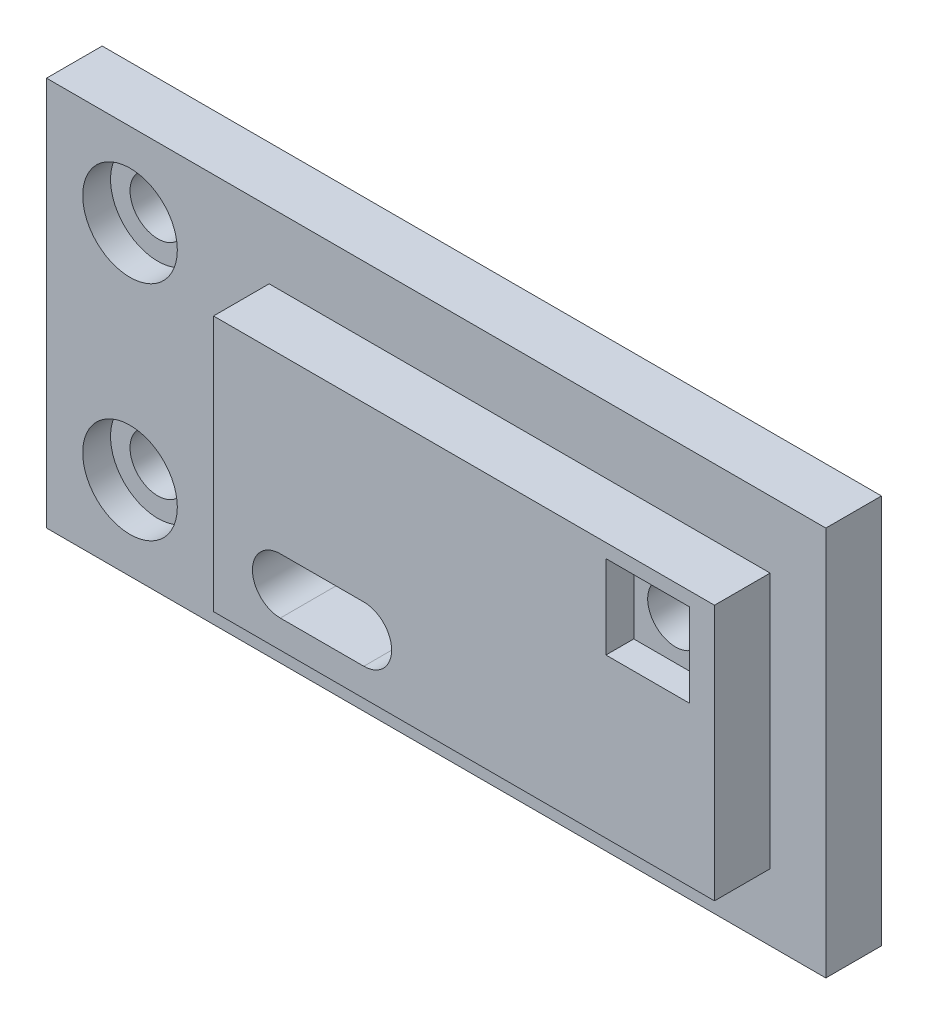
ISO-10303-21;
HEADER;
FILE_DESCRIPTION(('STEP AP214'),'2;1');
FILE_NAME('part.step','',(''),(''),'','','');
FILE_SCHEMA(('AUTOMOTIVE_DESIGN { 1 0 10303 214 1 1 1 1 }'));
ENDSEC;
DATA;
#1=APPLICATION_CONTEXT('core data for automotive mechanical design processes');
#2=APPLICATION_PROTOCOL_DEFINITION('international standard','automotive_design',2000,#1);
#3=PRODUCT_CONTEXT('',#1,'mechanical');
#4=PRODUCT('Part','Part','',(#3));
#5=PRODUCT_RELATED_PRODUCT_CATEGORY('part','',(#4));
#6=PRODUCT_DEFINITION_FORMATION('','',#4);
#7=PRODUCT_DEFINITION_CONTEXT('part definition',#1,'design');
#8=PRODUCT_DEFINITION('design','',#6,#7);
#9=PRODUCT_DEFINITION_SHAPE('','',#8);
#10=(LENGTH_UNIT() NAMED_UNIT(*) SI_UNIT(.MILLI.,.METRE.));
#11=(NAMED_UNIT(*) PLANE_ANGLE_UNIT() SI_UNIT($,.RADIAN.));
#12=(NAMED_UNIT(*) SI_UNIT($,.STERADIAN.) SOLID_ANGLE_UNIT());
#13=UNCERTAINTY_MEASURE_WITH_UNIT(LENGTH_MEASURE(1.E-05),#10,'distance_accuracy_value','');
#14=(GEOMETRIC_REPRESENTATION_CONTEXT(3) GLOBAL_UNCERTAINTY_ASSIGNED_CONTEXT((#13)) GLOBAL_UNIT_ASSIGNED_CONTEXT((#10,
#11,#12)) REPRESENTATION_CONTEXT('',''));
#15=CARTESIAN_POINT('',(0.,0.,0.));
#16=DIRECTION('',(0.,0.,1.));
#17=DIRECTION('',(1.,0.,0.));
#18=AXIS2_PLACEMENT_3D('',#15,#16,#17);
#19=CARTESIAN_POINT('',(-18.,-13.,0.));
#20=DIRECTION('',(0.,0.,1.));
#21=DIRECTION('',(1.,0.,0.));
#22=AXIS2_PLACEMENT_3D('',#19,#20,#21);
#23=CYLINDRICAL_SURFACE('',#22,5.);
#24=CARTESIAN_POINT('',(-18.,-13.,5.));
#25=DIRECTION('',(0.,0.,-1.));
#26=DIRECTION('',(-1.,0.,0.));
#27=AXIS2_PLACEMENT_3D('',#24,#25,#26);
#28=CIRCLE('',#27,5.);
#29=CARTESIAN_POINT('',(-18.,-7.99999999999999,5.));
#30=VERTEX_POINT('',#29);
#31=CARTESIAN_POINT('',(-18.,-18.,5.));
#32=VERTEX_POINT('',#31);
#33=EDGE_CURVE('E71',#30,#32,#28,.F.);
#34=ORIENTED_EDGE('',*,*,#33,.F.);
#35=DIRECTION('',(0.,0.,1.));
#36=VECTOR('',#35,1.);
#37=CARTESIAN_POINT('',(-18.,-7.99999999999999,0.));
#38=LINE('',#37,#36);
#39=CARTESIAN_POINT('',(-18.,-7.99999999999999,20.));
#40=VERTEX_POINT('',#39);
#41=EDGE_CURVE('E265',#30,#40,#38,.T.);
#42=ORIENTED_EDGE('',*,*,#41,.T.);
#43=CARTESIAN_POINT('',(-18.,-13.,20.));
#44=DIRECTION('',(0.,0.,1.));
#45=DIRECTION('',(-1.,0.,0.));
#46=AXIS2_PLACEMENT_3D('',#43,#44,#45);
#47=CIRCLE('',#46,5.);
#48=CARTESIAN_POINT('',(-18.,-18.,20.));
#49=VERTEX_POINT('',#48);
#50=EDGE_CURVE('E266',#40,#49,#47,.T.);
#51=ORIENTED_EDGE('',*,*,#50,.T.);
#52=DIRECTION('',(0.,0.,1.));
#53=VECTOR('',#52,1.);
#54=CARTESIAN_POINT('',(-18.,-18.,0.));
#55=LINE('',#54,#53);
#56=EDGE_CURVE('E278',#32,#49,#55,.T.);
#57=ORIENTED_EDGE('',*,*,#56,.F.);
#58=EDGE_LOOP('',(#34,#42,#51,#57));
#59=FACE_BOUND('',#58,.T.);
#60=ADVANCED_FACE('F49',(#59),#23,.F.);
#61=CARTESIAN_POINT('',(-18.,-7.99999999999999,0.));
#62=DIRECTION('',(0.,1.,0.));
#63=DIRECTION('',(0.,0.,1.));
#64=AXIS2_PLACEMENT_3D('',#61,#62,#63);
#65=PLANE('',#64);
#66=DIRECTION('',(-1.,0.,0.));
#67=VECTOR('',#66,1.);
#68=CARTESIAN_POINT('',(-18.,-7.99999999999999,5.));
#69=LINE('',#68,#67);
#70=CARTESIAN_POINT('',(-2.99999999999999,-7.99999999999999,5.));
#71=VERTEX_POINT('',#70);
#72=EDGE_CURVE('E225',#71,#30,#69,.T.);
#73=ORIENTED_EDGE('',*,*,#72,.F.);
#74=DIRECTION('',(0.,0.,1.));
#75=VECTOR('',#74,1.);
#76=CARTESIAN_POINT('',(-2.99999999999999,-7.99999999999999,0.));
#77=LINE('',#76,#75);
#78=CARTESIAN_POINT('',(-2.99999999999999,-7.99999999999999,20.));
#79=VERTEX_POINT('',#78);
#80=EDGE_CURVE('E280',#71,#79,#77,.T.);
#81=ORIENTED_EDGE('',*,*,#80,.T.);
#82=DIRECTION('',(-1.,0.,0.));
#83=VECTOR('',#82,1.);
#84=CARTESIAN_POINT('',(-18.,-7.99999999999999,20.));
#85=LINE('',#84,#83);
#86=EDGE_CURVE('E275',#79,#40,#85,.T.);
#87=ORIENTED_EDGE('',*,*,#86,.T.);
#88=ORIENTED_EDGE('',*,*,#41,.F.);
#89=EDGE_LOOP('',(#73,#81,#87,#88));
#90=FACE_BOUND('',#89,.T.);
#91=ADVANCED_FACE('F390',(#90),#65,.F.);
#92=CARTESIAN_POINT('',(-2.99999999999999,-13.,0.));
#93=DIRECTION('',(0.,0.,1.));
#94=DIRECTION('',(1.,0.,0.));
#95=AXIS2_PLACEMENT_3D('',#92,#93,#94);
#96=CYLINDRICAL_SURFACE('',#95,5.);
#97=CARTESIAN_POINT('',(-2.99999999999999,-13.,5.));
#98=DIRECTION('',(0.,0.,-1.));
#99=DIRECTION('',(-1.,0.,0.));
#100=AXIS2_PLACEMENT_3D('',#97,#98,#99);
#101=CIRCLE('',#100,5.);
#102=CARTESIAN_POINT('',(-2.99999999999999,-18.,5.));
#103=VERTEX_POINT('',#102);
#104=EDGE_CURVE('E220',#103,#71,#101,.F.);
#105=ORIENTED_EDGE('',*,*,#104,.F.);
#106=DIRECTION('',(0.,0.,1.));
#107=VECTOR('',#106,1.);
#108=CARTESIAN_POINT('',(-2.99999999999999,-18.,0.));
#109=LINE('',#108,#107);
#110=CARTESIAN_POINT('',(-2.99999999999999,-18.,20.));
#111=VERTEX_POINT('',#110);
#112=EDGE_CURVE('E282',#103,#111,#109,.T.);
#113=ORIENTED_EDGE('',*,*,#112,.T.);
#114=CARTESIAN_POINT('',(-2.99999999999999,-13.,20.));
#115=DIRECTION('',(0.,0.,1.));
#116=DIRECTION('',(1.,0.,0.));
#117=AXIS2_PLACEMENT_3D('',#114,#115,#116);
#118=CIRCLE('',#117,5.);
#119=EDGE_CURVE('E272',#111,#79,#118,.T.);
#120=ORIENTED_EDGE('',*,*,#119,.T.);
#121=ORIENTED_EDGE('',*,*,#80,.F.);
#122=EDGE_LOOP('',(#105,#113,#120,#121));
#123=FACE_BOUND('',#122,.T.);
#124=ADVANCED_FACE('F383',(#123),#96,.F.);
#125=CARTESIAN_POINT('',(-2.99999999999999,-18.,0.));
#126=DIRECTION('',(0.,-1.,0.));
#127=DIRECTION('',(0.,0.,-1.));
#128=AXIS2_PLACEMENT_3D('',#125,#126,#127);
#129=PLANE('',#128);
#130=DIRECTION('',(1.,0.,0.));
#131=VECTOR('',#130,1.);
#132=CARTESIAN_POINT('',(-2.99999999999999,-18.,5.));
#133=LINE('',#132,#131);
#134=EDGE_CURVE('E13',#32,#103,#133,.T.);
#135=ORIENTED_EDGE('',*,*,#134,.F.);
#136=ORIENTED_EDGE('',*,*,#56,.T.);
#137=DIRECTION('',(1.,0.,0.));
#138=VECTOR('',#137,1.);
#139=CARTESIAN_POINT('',(-2.99999999999999,-18.,20.));
#140=LINE('',#139,#138);
#141=EDGE_CURVE('E269',#49,#111,#140,.T.);
#142=ORIENTED_EDGE('',*,*,#141,.T.);
#143=ORIENTED_EDGE('',*,*,#112,.F.);
#144=EDGE_LOOP('',(#135,#136,#142,#143));
#145=FACE_BOUND('',#144,.T.);
#146=ADVANCED_FACE('F373',(#145),#129,.F.);
#147=CARTESIAN_POINT('',(48.,13.,0.));
#148=DIRECTION('',(0.,0.,1.));
#149=DIRECTION('',(1.,0.,0.));
#150=AXIS2_PLACEMENT_3D('',#147,#148,#149);
#151=CYLINDRICAL_SURFACE('',#150,5.);
#152=CARTESIAN_POINT('',(48.,13.,0.));
#153=DIRECTION('',(0.,0.,1.));
#154=DIRECTION('',(1.,0.,0.));
#155=AXIS2_PLACEMENT_3D('',#152,#153,#154);
#156=CIRCLE('',#155,5.);
#157=CARTESIAN_POINT('',(53.,13.,0.));
#158=VERTEX_POINT('',#157);
#159=EDGE_CURVE('E261',#158,#158,#156,.T.);
#160=ORIENTED_EDGE('',*,*,#159,.F.);
#161=EDGE_LOOP('',(#160));
#162=FACE_BOUND('',#161,.T.);
#163=CARTESIAN_POINT('',(48.,13.,15.));
#164=DIRECTION('',(0.,0.,1.));
#165=DIRECTION('',(1.,0.,0.));
#166=AXIS2_PLACEMENT_3D('',#163,#164,#165);
#167=CIRCLE('',#166,5.);
#168=CARTESIAN_POINT('',(53.,13.,15.));
#169=VERTEX_POINT('',#168);
#170=EDGE_CURVE('E254',#169,#169,#167,.F.);
#171=ORIENTED_EDGE('',*,*,#170,.F.);
#172=EDGE_LOOP('',(#171));
#173=FACE_BOUND('',#172,.T.);
#174=ADVANCED_FACE('F370',(#162,#173),#151,.F.);
#175=CARTESIAN_POINT('',(0.,0.,10.));
#176=DIRECTION('',(0.,0.,1.));
#177=DIRECTION('',(1.,0.,0.));
#178=AXIS2_PLACEMENT_3D('',#175,#176,#177);
#179=PLANE('',#178);
#180=CARTESIAN_POINT('',(-55.,20.,10.));
#181=DIRECTION('',(0.,0.,1.));
#182=DIRECTION('',(1.,0.,0.));
#183=AXIS2_PLACEMENT_3D('',#180,#181,#182);
#184=CIRCLE('',#183,8.5);
#185=CARTESIAN_POINT('',(-46.5,20.,10.));
#186=VERTEX_POINT('',#185);
#187=EDGE_CURVE('E318',#186,#186,#184,.T.);
#188=ORIENTED_EDGE('',*,*,#187,.F.);
#189=EDGE_LOOP('',(#188));
#190=FACE_BOUND('',#189,.T.);
#191=CARTESIAN_POINT('',(-55.,-20.,10.));
#192=DIRECTION('',(0.,0.,1.));
#193=DIRECTION('',(1.,0.,0.));
#194=AXIS2_PLACEMENT_3D('',#191,#192,#193);
#195=CIRCLE('',#194,8.5);
#196=CARTESIAN_POINT('',(-46.5,-20.,10.));
#197=VERTEX_POINT('',#196);
#198=EDGE_CURVE('E313',#197,#197,#195,.T.);
#199=ORIENTED_EDGE('',*,*,#198,.F.);
#200=EDGE_LOOP('',(#199));
#201=FACE_BOUND('',#200,.T.);
#202=DIRECTION('',(0.,-1.,0.));
#203=VECTOR('',#202,1.);
#204=CARTESIAN_POINT('',(-70.,35.,10.));
#205=LINE('',#204,#203);
#206=CARTESIAN_POINT('',(-70.,35.,10.));
#207=VERTEX_POINT('',#206);
#208=CARTESIAN_POINT('',(-70.,-35.,10.));
#209=VERTEX_POINT('',#208);
#210=EDGE_CURVE('E334',#207,#209,#205,.T.);
#211=ORIENTED_EDGE('',*,*,#210,.T.);
#212=DIRECTION('',(1.,0.,0.));
#213=VECTOR('',#212,1.);
#214=CARTESIAN_POINT('',(-70.,-35.,10.));
#215=LINE('',#214,#213);
#216=CARTESIAN_POINT('',(70.,-35.,10.));
#217=VERTEX_POINT('',#216);
#218=EDGE_CURVE('E337',#209,#217,#215,.T.);
#219=ORIENTED_EDGE('',*,*,#218,.T.);
#220=DIRECTION('',(0.,1.,0.));
#221=VECTOR('',#220,1.);
#222=CARTESIAN_POINT('',(70.,35.,10.));
#223=LINE('',#222,#221);
#224=CARTESIAN_POINT('',(70.,35.,10.));
#225=VERTEX_POINT('',#224);
#226=EDGE_CURVE('E340',#217,#225,#223,.T.);
#227=ORIENTED_EDGE('',*,*,#226,.T.);
#228=DIRECTION('',(-1.,0.,0.));
#229=VECTOR('',#228,1.);
#230=CARTESIAN_POINT('',(-70.,35.,10.));
#231=LINE('',#230,#229);
#232=EDGE_CURVE('E342',#225,#207,#231,.T.);
#233=ORIENTED_EDGE('',*,*,#232,.T.);
#234=EDGE_LOOP('',(#211,#219,#227,#233));
#235=FACE_BOUND('',#234,.T.);
#236=DIRECTION('',(1.,0.,0.));
#237=VECTOR('',#236,1.);
#238=CARTESIAN_POINT('',(-30.,-23.,10.));
#239=LINE('',#238,#237);
#240=CARTESIAN_POINT('',(-30.,-23.,10.));
#241=VERTEX_POINT('',#240);
#242=CARTESIAN_POINT('',(60.,-23.,10.));
#243=VERTEX_POINT('',#242);
#244=EDGE_CURVE('E298',#241,#243,#239,.T.);
#245=ORIENTED_EDGE('',*,*,#244,.F.);
#246=DIRECTION('',(0.,-1.,0.));
#247=VECTOR('',#246,1.);
#248=CARTESIAN_POINT('',(-30.,23.,10.));
#249=LINE('',#248,#247);
#250=CARTESIAN_POINT('',(-30.,23.,10.));
#251=VERTEX_POINT('',#250);
#252=EDGE_CURVE('E264',#251,#241,#249,.T.);
#253=ORIENTED_EDGE('',*,*,#252,.F.);
#254=DIRECTION('',(-1.,0.,0.));
#255=VECTOR('',#254,1.);
#256=CARTESIAN_POINT('',(-30.,23.,10.));
#257=LINE('',#256,#255);
#258=CARTESIAN_POINT('',(60.,23.,10.));
#259=VERTEX_POINT('',#258);
#260=EDGE_CURVE('E289',#259,#251,#257,.T.);
#261=ORIENTED_EDGE('',*,*,#260,.F.);
#262=DIRECTION('',(0.,1.,0.));
#263=VECTOR('',#262,1.);
#264=CARTESIAN_POINT('',(60.,23.,10.));
#265=LINE('',#264,#263);
#266=EDGE_CURVE('E300',#243,#259,#265,.T.);
#267=ORIENTED_EDGE('',*,*,#266,.F.);
#268=EDGE_LOOP('',(#245,#253,#261,#267));
#269=FACE_BOUND('',#268,.T.);
#270=ADVANCED_FACE('F372',(#190,#201,#235,#269),#179,.T.);
#271=CARTESIAN_POINT('',(-55.,20.,10.));
#272=DIRECTION('',(0.,0.,-1.));
#273=DIRECTION('',(-1.,0.,0.));
#274=AXIS2_PLACEMENT_3D('',#271,#272,#273);
#275=CYLINDRICAL_SURFACE('',#274,5.);
#276=CARTESIAN_POINT('',(-55.,20.,0.));
#277=DIRECTION('',(0.,0.,1.));
#278=DIRECTION('',(1.,0.,0.));
#279=AXIS2_PLACEMENT_3D('',#276,#277,#278);
#280=CIRCLE('',#279,5.);
#281=CARTESIAN_POINT('',(-50.,20.,0.));
#282=VERTEX_POINT('',#281);
#283=EDGE_CURVE('E329',#282,#282,#280,.T.);
#284=ORIENTED_EDGE('',*,*,#283,.F.);
#285=EDGE_LOOP('',(#284));
#286=FACE_BOUND('',#285,.T.);
#287=CARTESIAN_POINT('',(-55.,20.,5.));
#288=DIRECTION('',(0.,0.,1.));
#289=DIRECTION('',(1.,0.,0.));
#290=AXIS2_PLACEMENT_3D('',#287,#288,#289);
#291=CIRCLE('',#290,5.);
#292=CARTESIAN_POINT('',(-50.,20.,5.));
#293=VERTEX_POINT('',#292);
#294=EDGE_CURVE('E330',#293,#293,#291,.T.);
#295=ORIENTED_EDGE('',*,*,#294,.T.);
#296=EDGE_LOOP('',(#295));
#297=FACE_BOUND('',#296,.T.);
#298=ADVANCED_FACE('F380',(#286,#297),#275,.F.);
#299=CARTESIAN_POINT('',(-55.,-20.,10.));
#300=DIRECTION('',(0.,0.,-1.));
#301=DIRECTION('',(-1.,0.,0.));
#302=AXIS2_PLACEMENT_3D('',#299,#300,#301);
#303=CYLINDRICAL_SURFACE('',#302,5.);
#304=CARTESIAN_POINT('',(-55.,-20.,0.));
#305=DIRECTION('',(0.,0.,1.));
#306=DIRECTION('',(1.,0.,0.));
#307=AXIS2_PLACEMENT_3D('',#304,#305,#306);
#308=CIRCLE('',#307,5.);
#309=CARTESIAN_POINT('',(-50.,-20.,0.));
#310=VERTEX_POINT('',#309);
#311=EDGE_CURVE('E326',#310,#310,#308,.T.);
#312=ORIENTED_EDGE('',*,*,#311,.F.);
#313=EDGE_LOOP('',(#312));
#314=FACE_BOUND('',#313,.T.);
#315=CARTESIAN_POINT('',(-55.,-20.,5.));
#316=DIRECTION('',(0.,0.,1.));
#317=DIRECTION('',(1.,0.,0.));
#318=AXIS2_PLACEMENT_3D('',#315,#316,#317);
#319=CIRCLE('',#318,5.);
#320=CARTESIAN_POINT('',(-50.,-20.,5.));
#321=VERTEX_POINT('',#320);
#322=EDGE_CURVE('E317',#321,#321,#319,.T.);
#323=ORIENTED_EDGE('',*,*,#322,.T.);
#324=EDGE_LOOP('',(#323));
#325=FACE_BOUND('',#324,.T.);
#326=ADVANCED_FACE('F436',(#314,#325),#303,.F.);
#327=CARTESIAN_POINT('',(0.,0.,0.));
#328=DIRECTION('',(0.,0.,1.));
#329=DIRECTION('',(1.,0.,0.));
#330=AXIS2_PLACEMENT_3D('',#327,#328,#329);
#331=PLANE('',#330);
#332=DIRECTION('',(1.,0.,0.));
#333=VECTOR('',#332,1.);
#334=CARTESIAN_POINT('',(-18.,-5.99999999999999,0.));
#335=LINE('',#334,#333);
#336=CARTESIAN_POINT('',(-18.,-5.99999999999999,0.));
#337=VERTEX_POINT('',#336);
#338=CARTESIAN_POINT('',(-2.99999999999999,-5.99999999999999,0.));
#339=VERTEX_POINT('',#338);
#340=EDGE_CURVE('E214',#337,#339,#335,.T.);
#341=ORIENTED_EDGE('',*,*,#340,.F.);
#342=CARTESIAN_POINT('',(-18.,-13.,0.));
#343=DIRECTION('',(0.,0.,-1.));
#344=DIRECTION('',(-1.,0.,0.));
#345=AXIS2_PLACEMENT_3D('',#342,#343,#344);
#346=CIRCLE('',#345,7.);
#347=CARTESIAN_POINT('',(-18.,-20.,0.));
#348=VERTEX_POINT('',#347);
#349=EDGE_CURVE('E64',#348,#337,#346,.T.);
#350=ORIENTED_EDGE('',*,*,#349,.F.);
#351=DIRECTION('',(-1.,0.,0.));
#352=VECTOR('',#351,1.);
#353=CARTESIAN_POINT('',(-18.,-20.,0.));
#354=LINE('',#353,#352);
#355=CARTESIAN_POINT('',(-2.99999999999999,-20.,0.));
#356=VERTEX_POINT('',#355);
#357=EDGE_CURVE('E205',#356,#348,#354,.T.);
#358=ORIENTED_EDGE('',*,*,#357,.F.);
#359=CARTESIAN_POINT('',(-2.99999999999999,-13.,0.));
#360=DIRECTION('',(0.,0.,-1.));
#361=DIRECTION('',(1.,0.,0.));
#362=AXIS2_PLACEMENT_3D('',#359,#360,#361);
#363=CIRCLE('',#362,7.);
#364=EDGE_CURVE('E208',#339,#356,#363,.T.);
#365=ORIENTED_EDGE('',*,*,#364,.F.);
#366=EDGE_LOOP('',(#341,#350,#358,#365));
#367=FACE_BOUND('',#366,.T.);
#368=ORIENTED_EDGE('',*,*,#159,.T.);
#369=EDGE_LOOP('',(#368));
#370=FACE_BOUND('',#369,.T.);
#371=DIRECTION('',(0.,-1.,0.));
#372=VECTOR('',#371,1.);
#373=CARTESIAN_POINT('',(-70.,35.,0.));
#374=LINE('',#373,#372);
#375=CARTESIAN_POINT('',(-70.,35.,0.));
#376=VERTEX_POINT('',#375);
#377=CARTESIAN_POINT('',(-70.,-35.,0.));
#378=VERTEX_POINT('',#377);
#379=EDGE_CURVE('E333',#376,#378,#374,.T.);
#380=ORIENTED_EDGE('',*,*,#379,.F.);
#381=DIRECTION('',(-1.,0.,0.));
#382=VECTOR('',#381,1.);
#383=CARTESIAN_POINT('',(-70.,35.,0.));
#384=LINE('',#383,#382);
#385=CARTESIAN_POINT('',(70.,35.,0.));
#386=VERTEX_POINT('',#385);
#387=EDGE_CURVE('E338',#386,#376,#384,.T.);
#388=ORIENTED_EDGE('',*,*,#387,.F.);
#389=DIRECTION('',(0.,1.,0.));
#390=VECTOR('',#389,1.);
#391=CARTESIAN_POINT('',(70.,35.,0.));
#392=LINE('',#391,#390);
#393=CARTESIAN_POINT('',(70.,-35.,0.));
#394=VERTEX_POINT('',#393);
#395=EDGE_CURVE('E349',#394,#386,#392,.T.);
#396=ORIENTED_EDGE('',*,*,#395,.F.);
#397=DIRECTION('',(1.,0.,0.));
#398=VECTOR('',#397,1.);
#399=CARTESIAN_POINT('',(-70.,-35.,0.));
#400=LINE('',#399,#398);
#401=EDGE_CURVE('E347',#378,#394,#400,.T.);
#402=ORIENTED_EDGE('',*,*,#401,.F.);
#403=EDGE_LOOP('',(#380,#388,#396,#402));
#404=FACE_BOUND('',#403,.T.);
#405=ORIENTED_EDGE('',*,*,#283,.T.);
#406=EDGE_LOOP('',(#405));
#407=FACE_BOUND('',#406,.T.);
#408=ORIENTED_EDGE('',*,*,#311,.T.);
#409=EDGE_LOOP('',(#408));
#410=FACE_BOUND('',#409,.T.);
#411=ADVANCED_FACE('F439',(#367,#370,#404,#407,#410),#331,.F.);
#412=CARTESIAN_POINT('',(-70.,35.,10.));
#413=DIRECTION('',(1.,0.,0.));
#414=DIRECTION('',(0.,1.,0.));
#415=AXIS2_PLACEMENT_3D('',#412,#413,#414);
#416=PLANE('',#415);
#417=ORIENTED_EDGE('',*,*,#379,.T.);
#418=DIRECTION('',(0.,0.,-1.));
#419=VECTOR('',#418,1.);
#420=CARTESIAN_POINT('',(-70.,-35.,10.));
#421=LINE('',#420,#419);
#422=EDGE_CURVE('E57',#209,#378,#421,.T.);
#423=ORIENTED_EDGE('',*,*,#422,.F.);
#424=ORIENTED_EDGE('',*,*,#210,.F.);
#425=DIRECTION('',(0.,0.,-1.));
#426=VECTOR('',#425,1.);
#427=CARTESIAN_POINT('',(-70.,35.,10.));
#428=LINE('',#427,#426);
#429=EDGE_CURVE('E344',#207,#376,#428,.T.);
#430=ORIENTED_EDGE('',*,*,#429,.T.);
#431=EDGE_LOOP('',(#417,#423,#424,#430));
#432=FACE_BOUND('',#431,.T.);
#433=ADVANCED_FACE('F51',(#432),#416,.F.);
#434=CARTESIAN_POINT('',(-70.,-35.,10.));
#435=DIRECTION('',(0.,1.,0.));
#436=DIRECTION('',(0.,0.,1.));
#437=AXIS2_PLACEMENT_3D('',#434,#435,#436);
#438=PLANE('',#437);
#439=ORIENTED_EDGE('',*,*,#401,.T.);
#440=DIRECTION('',(0.,0.,-1.));
#441=VECTOR('',#440,1.);
#442=CARTESIAN_POINT('',(70.,-35.,10.));
#443=LINE('',#442,#441);
#444=EDGE_CURVE('E357',#217,#394,#443,.T.);
#445=ORIENTED_EDGE('',*,*,#444,.F.);
#446=ORIENTED_EDGE('',*,*,#218,.F.);
#447=ORIENTED_EDGE('',*,*,#422,.T.);
#448=EDGE_LOOP('',(#439,#445,#446,#447));
#449=FACE_BOUND('',#448,.T.);
#450=ADVANCED_FACE('F452',(#449),#438,.F.);
#451=CARTESIAN_POINT('',(70.,35.,10.));
#452=DIRECTION('',(-1.,0.,0.));
#453=DIRECTION('',(0.,-1.,0.));
#454=AXIS2_PLACEMENT_3D('',#451,#452,#453);
#455=PLANE('',#454);
#456=ORIENTED_EDGE('',*,*,#395,.T.);
#457=DIRECTION('',(0.,0.,-1.));
#458=VECTOR('',#457,1.);
#459=CARTESIAN_POINT('',(70.,35.,10.));
#460=LINE('',#459,#458);
#461=EDGE_CURVE('E354',#225,#386,#460,.T.);
#462=ORIENTED_EDGE('',*,*,#461,.F.);
#463=ORIENTED_EDGE('',*,*,#226,.F.);
#464=ORIENTED_EDGE('',*,*,#444,.T.);
#465=EDGE_LOOP('',(#456,#462,#463,#464));
#466=FACE_BOUND('',#465,.T.);
#467=ADVANCED_FACE('F449',(#466),#455,.F.);
#468=CARTESIAN_POINT('',(-70.,35.,10.));
#469=DIRECTION('',(0.,-1.,0.));
#470=DIRECTION('',(0.,0.,-1.));
#471=AXIS2_PLACEMENT_3D('',#468,#469,#470);
#472=PLANE('',#471);
#473=ORIENTED_EDGE('',*,*,#387,.T.);
#474=ORIENTED_EDGE('',*,*,#429,.F.);
#475=ORIENTED_EDGE('',*,*,#232,.F.);
#476=ORIENTED_EDGE('',*,*,#461,.T.);
#477=EDGE_LOOP('',(#473,#474,#475,#476));
#478=FACE_BOUND('',#477,.T.);
#479=ADVANCED_FACE('F434',(#478),#472,.F.);
#480=CARTESIAN_POINT('',(-55.,-20.,5.));
#481=DIRECTION('',(0.,0.,1.));
#482=DIRECTION('',(1.,0.,0.));
#483=AXIS2_PLACEMENT_3D('',#480,#481,#482);
#484=CYLINDRICAL_SURFACE('',#483,8.5);
#485=CARTESIAN_POINT('',(-55.,-20.,5.));
#486=DIRECTION('',(0.,0.,1.));
#487=DIRECTION('',(1.,0.,0.));
#488=AXIS2_PLACEMENT_3D('',#485,#486,#487);
#489=CIRCLE('',#488,8.5);
#490=CARTESIAN_POINT('',(-46.5,-20.,5.));
#491=VERTEX_POINT('',#490);
#492=EDGE_CURVE('E321',#491,#491,#489,.T.);
#493=ORIENTED_EDGE('',*,*,#492,.F.);
#494=EDGE_LOOP('',(#493));
#495=FACE_BOUND('',#494,.T.);
#496=ORIENTED_EDGE('',*,*,#198,.T.);
#497=EDGE_LOOP('',(#496));
#498=FACE_BOUND('',#497,.T.);
#499=ADVANCED_FACE('F430',(#495,#498),#484,.F.);
#500=CARTESIAN_POINT('',(-55.,-20.,5.));
#501=DIRECTION('',(0.,0.,1.));
#502=DIRECTION('',(1.,0.,0.));
#503=AXIS2_PLACEMENT_3D('',#500,#501,#502);
#504=PLANE('',#503);
#505=ORIENTED_EDGE('',*,*,#322,.F.);
#506=EDGE_LOOP('',(#505));
#507=FACE_BOUND('',#506,.T.);
#508=ORIENTED_EDGE('',*,*,#492,.T.);
#509=EDGE_LOOP('',(#508));
#510=FACE_BOUND('',#509,.T.);
#511=ADVANCED_FACE('F426',(#507,#510),#504,.T.);
#512=CARTESIAN_POINT('',(-55.,20.,5.));
#513=DIRECTION('',(0.,0.,1.));
#514=DIRECTION('',(1.,0.,0.));
#515=AXIS2_PLACEMENT_3D('',#512,#513,#514);
#516=CYLINDRICAL_SURFACE('',#515,8.5);
#517=CARTESIAN_POINT('',(-55.,20.,5.));
#518=DIRECTION('',(0.,0.,1.));
#519=DIRECTION('',(1.,0.,0.));
#520=AXIS2_PLACEMENT_3D('',#517,#518,#519);
#521=CIRCLE('',#520,8.5);
#522=CARTESIAN_POINT('',(-46.5,20.,5.));
#523=VERTEX_POINT('',#522);
#524=EDGE_CURVE('E314',#523,#523,#521,.T.);
#525=ORIENTED_EDGE('',*,*,#524,.F.);
#526=EDGE_LOOP('',(#525));
#527=FACE_BOUND('',#526,.T.);
#528=ORIENTED_EDGE('',*,*,#187,.T.);
#529=EDGE_LOOP('',(#528));
#530=FACE_BOUND('',#529,.T.);
#531=ADVANCED_FACE('F422',(#527,#530),#516,.F.);
#532=CARTESIAN_POINT('',(-55.,20.,5.));
#533=DIRECTION('',(0.,0.,1.));
#534=DIRECTION('',(1.,0.,0.));
#535=AXIS2_PLACEMENT_3D('',#532,#533,#534);
#536=PLANE('',#535);
#537=ORIENTED_EDGE('',*,*,#294,.F.);
#538=EDGE_LOOP('',(#537));
#539=FACE_BOUND('',#538,.T.);
#540=ORIENTED_EDGE('',*,*,#524,.T.);
#541=EDGE_LOOP('',(#540));
#542=FACE_BOUND('',#541,.T.);
#543=ADVANCED_FACE('F418',(#539,#542),#536,.T.);
#544=CARTESIAN_POINT('',(-30.,23.,20.));
#545=DIRECTION('',(1.,0.,0.));
#546=DIRECTION('',(0.,1.,0.));
#547=AXIS2_PLACEMENT_3D('',#544,#545,#546);
#548=PLANE('',#547);
#549=ORIENTED_EDGE('',*,*,#252,.T.);
#550=DIRECTION('',(0.,0.,-1.));
#551=VECTOR('',#550,1.);
#552=CARTESIAN_POINT('',(-30.,-23.,20.));
#553=LINE('',#552,#551);
#554=CARTESIAN_POINT('',(-30.,-23.,20.));
#555=VERTEX_POINT('',#554);
#556=EDGE_CURVE('E311',#555,#241,#553,.T.);
#557=ORIENTED_EDGE('',*,*,#556,.F.);
#558=DIRECTION('',(0.,-1.,0.));
#559=VECTOR('',#558,1.);
#560=CARTESIAN_POINT('',(-30.,23.,20.));
#561=LINE('',#560,#559);
#562=CARTESIAN_POINT('',(-30.,23.,20.));
#563=VERTEX_POINT('',#562);
#564=EDGE_CURVE('E285',#563,#555,#561,.T.);
#565=ORIENTED_EDGE('',*,*,#564,.F.);
#566=DIRECTION('',(0.,0.,-1.));
#567=VECTOR('',#566,1.);
#568=CARTESIAN_POINT('',(-30.,23.,20.));
#569=LINE('',#568,#567);
#570=EDGE_CURVE('E295',#563,#251,#569,.T.);
#571=ORIENTED_EDGE('',*,*,#570,.T.);
#572=EDGE_LOOP('',(#549,#557,#565,#571));
#573=FACE_BOUND('',#572,.T.);
#574=ADVANCED_FACE('F414',(#573),#548,.F.);
#575=CARTESIAN_POINT('',(-30.,-23.,20.));
#576=DIRECTION('',(0.,1.,0.));
#577=DIRECTION('',(0.,0.,1.));
#578=AXIS2_PLACEMENT_3D('',#575,#576,#577);
#579=PLANE('',#578);
#580=ORIENTED_EDGE('',*,*,#244,.T.);
#581=DIRECTION('',(0.,0.,-1.));
#582=VECTOR('',#581,1.);
#583=CARTESIAN_POINT('',(60.,-23.,20.));
#584=LINE('',#583,#582);
#585=CARTESIAN_POINT('',(60.,-23.,20.));
#586=VERTEX_POINT('',#585);
#587=EDGE_CURVE('E308',#586,#243,#584,.T.);
#588=ORIENTED_EDGE('',*,*,#587,.F.);
#589=DIRECTION('',(1.,0.,0.));
#590=VECTOR('',#589,1.);
#591=CARTESIAN_POINT('',(-30.,-23.,20.));
#592=LINE('',#591,#590);
#593=EDGE_CURVE('E288',#555,#586,#592,.T.);
#594=ORIENTED_EDGE('',*,*,#593,.F.);
#595=ORIENTED_EDGE('',*,*,#556,.T.);
#596=EDGE_LOOP('',(#580,#588,#594,#595));
#597=FACE_BOUND('',#596,.T.);
#598=ADVANCED_FACE('F410',(#597),#579,.F.);
#599=CARTESIAN_POINT('',(60.,23.,20.));
#600=DIRECTION('',(-1.,0.,0.));
#601=DIRECTION('',(0.,-1.,0.));
#602=AXIS2_PLACEMENT_3D('',#599,#600,#601);
#603=PLANE('',#602);
#604=ORIENTED_EDGE('',*,*,#266,.T.);
#605=DIRECTION('',(0.,0.,-1.));
#606=VECTOR('',#605,1.);
#607=CARTESIAN_POINT('',(60.,23.,20.));
#608=LINE('',#607,#606);
#609=CARTESIAN_POINT('',(60.,23.,20.));
#610=VERTEX_POINT('',#609);
#611=EDGE_CURVE('E306',#610,#259,#608,.T.);
#612=ORIENTED_EDGE('',*,*,#611,.F.);
#613=DIRECTION('',(0.,1.,0.));
#614=VECTOR('',#613,1.);
#615=CARTESIAN_POINT('',(60.,23.,20.));
#616=LINE('',#615,#614);
#617=EDGE_CURVE('E291',#586,#610,#616,.T.);
#618=ORIENTED_EDGE('',*,*,#617,.F.);
#619=ORIENTED_EDGE('',*,*,#587,.T.);
#620=EDGE_LOOP('',(#604,#612,#618,#619));
#621=FACE_BOUND('',#620,.T.);
#622=ADVANCED_FACE('F406',(#621),#603,.F.);
#623=CARTESIAN_POINT('',(-30.,23.,20.));
#624=DIRECTION('',(0.,-1.,0.));
#625=DIRECTION('',(0.,0.,-1.));
#626=AXIS2_PLACEMENT_3D('',#623,#624,#625);
#627=PLANE('',#626);
#628=ORIENTED_EDGE('',*,*,#260,.T.);
#629=ORIENTED_EDGE('',*,*,#570,.F.);
#630=DIRECTION('',(-1.,0.,0.));
#631=VECTOR('',#630,1.);
#632=CARTESIAN_POINT('',(-30.,23.,20.));
#633=LINE('',#632,#631);
#634=EDGE_CURVE('E293',#610,#563,#633,.T.);
#635=ORIENTED_EDGE('',*,*,#634,.F.);
#636=ORIENTED_EDGE('',*,*,#611,.T.);
#637=EDGE_LOOP('',(#628,#629,#635,#636));
#638=FACE_BOUND('',#637,.T.);
#639=ADVANCED_FACE('F402',(#638),#627,.F.);
#640=CARTESIAN_POINT('',(0.,0.,20.));
#641=DIRECTION('',(0.,0.,1.));
#642=DIRECTION('',(1.,0.,0.));
#643=AXIS2_PLACEMENT_3D('',#640,#641,#642);
#644=PLANE('',#643);
#645=DIRECTION('',(0.,-1.,0.));
#646=VECTOR('',#645,1.);
#647=CARTESIAN_POINT('',(40.5,20.5,20.));
#648=LINE('',#647,#646);
#649=CARTESIAN_POINT('',(40.5,20.5,20.));
#650=VERTEX_POINT('',#649);
#651=CARTESIAN_POINT('',(40.5,5.5,20.));
#652=VERTEX_POINT('',#651);
#653=EDGE_CURVE('E228',#650,#652,#648,.T.);
#654=ORIENTED_EDGE('',*,*,#653,.F.);
#655=DIRECTION('',(-1.,0.,0.));
#656=VECTOR('',#655,1.);
#657=CARTESIAN_POINT('',(40.5,20.5,20.));
#658=LINE('',#657,#656);
#659=CARTESIAN_POINT('',(55.5,20.5,20.));
#660=VERTEX_POINT('',#659);
#661=EDGE_CURVE('E233',#660,#650,#658,.T.);
#662=ORIENTED_EDGE('',*,*,#661,.F.);
#663=DIRECTION('',(0.,1.,0.));
#664=VECTOR('',#663,1.);
#665=CARTESIAN_POINT('',(55.5,20.5,20.));
#666=LINE('',#665,#664);
#667=CARTESIAN_POINT('',(55.5,5.5,20.));
#668=VERTEX_POINT('',#667);
#669=EDGE_CURVE('E247',#668,#660,#666,.T.);
#670=ORIENTED_EDGE('',*,*,#669,.F.);
#671=DIRECTION('',(1.,0.,0.));
#672=VECTOR('',#671,1.);
#673=CARTESIAN_POINT('',(40.5,5.5,20.));
#674=LINE('',#673,#672);
#675=EDGE_CURVE('E244',#652,#668,#674,.T.);
#676=ORIENTED_EDGE('',*,*,#675,.F.);
#677=EDGE_LOOP('',(#654,#662,#670,#676));
#678=FACE_BOUND('',#677,.T.);
#679=ORIENTED_EDGE('',*,*,#50,.F.);
#680=ORIENTED_EDGE('',*,*,#86,.F.);
#681=ORIENTED_EDGE('',*,*,#119,.F.);
#682=ORIENTED_EDGE('',*,*,#141,.F.);
#683=EDGE_LOOP('',(#679,#680,#681,#682));
#684=FACE_BOUND('',#683,.T.);
#685=ORIENTED_EDGE('',*,*,#564,.T.);
#686=ORIENTED_EDGE('',*,*,#593,.T.);
#687=ORIENTED_EDGE('',*,*,#617,.T.);
#688=ORIENTED_EDGE('',*,*,#634,.T.);
#689=EDGE_LOOP('',(#685,#686,#687,#688));
#690=FACE_BOUND('',#689,.T.);
#691=ADVANCED_FACE('F399',(#678,#684,#690),#644,.T.);
#692=CARTESIAN_POINT('',(0.,0.,15.));
#693=DIRECTION('',(0.,0.,1.));
#694=DIRECTION('',(1.,0.,0.));
#695=AXIS2_PLACEMENT_3D('',#692,#693,#694);
#696=PLANE('',#695);
#697=DIRECTION('',(0.,-1.,0.));
#698=VECTOR('',#697,1.);
#699=CARTESIAN_POINT('',(40.5,20.5,15.));
#700=LINE('',#699,#698);
#701=CARTESIAN_POINT('',(40.5,20.5,15.));
#702=VERTEX_POINT('',#701);
#703=CARTESIAN_POINT('',(40.5,5.5,15.));
#704=VERTEX_POINT('',#703);
#705=EDGE_CURVE('E229',#702,#704,#700,.T.);
#706=ORIENTED_EDGE('',*,*,#705,.T.);
#707=DIRECTION('',(1.,0.,0.));
#708=VECTOR('',#707,1.);
#709=CARTESIAN_POINT('',(40.5,5.5,15.));
#710=LINE('',#709,#708);
#711=CARTESIAN_POINT('',(55.5,5.5,15.));
#712=VERTEX_POINT('',#711);
#713=EDGE_CURVE('E232',#704,#712,#710,.T.);
#714=ORIENTED_EDGE('',*,*,#713,.T.);
#715=DIRECTION('',(0.,1.,0.));
#716=VECTOR('',#715,1.);
#717=CARTESIAN_POINT('',(55.5,20.5,15.));
#718=LINE('',#717,#716);
#719=CARTESIAN_POINT('',(55.5,20.5,15.));
#720=VERTEX_POINT('',#719);
#721=EDGE_CURVE('E236',#712,#720,#718,.T.);
#722=ORIENTED_EDGE('',*,*,#721,.T.);
#723=DIRECTION('',(-1.,0.,0.));
#724=VECTOR('',#723,1.);
#725=CARTESIAN_POINT('',(40.5,20.5,15.));
#726=LINE('',#725,#724);
#727=EDGE_CURVE('E239',#720,#702,#726,.T.);
#728=ORIENTED_EDGE('',*,*,#727,.T.);
#729=EDGE_LOOP('',(#706,#714,#722,#728));
#730=FACE_BOUND('',#729,.T.);
#731=ORIENTED_EDGE('',*,*,#170,.T.);
#732=EDGE_LOOP('',(#731));
#733=FACE_BOUND('',#732,.T.);
#734=ADVANCED_FACE('F368',(#730,#733),#696,.T.);
#735=CARTESIAN_POINT('',(40.5,20.5,15.));
#736=DIRECTION('',(-1.,0.,0.));
#737=DIRECTION('',(0.,0.,1.));
#738=AXIS2_PLACEMENT_3D('',#735,#736,#737);
#739=PLANE('',#738);
#740=ORIENTED_EDGE('',*,*,#653,.T.);
#741=DIRECTION('',(0.,0.,1.));
#742=VECTOR('',#741,1.);
#743=CARTESIAN_POINT('',(40.5,5.5,15.));
#744=LINE('',#743,#742);
#745=EDGE_CURVE('E242',#704,#652,#744,.T.);
#746=ORIENTED_EDGE('',*,*,#745,.F.);
#747=ORIENTED_EDGE('',*,*,#705,.F.);
#748=DIRECTION('',(0.,0.,1.));
#749=VECTOR('',#748,1.);
#750=CARTESIAN_POINT('',(40.5,20.5,15.));
#751=LINE('',#750,#749);
#752=EDGE_CURVE('E252',#702,#650,#751,.T.);
#753=ORIENTED_EDGE('',*,*,#752,.T.);
#754=EDGE_LOOP('',(#740,#746,#747,#753));
#755=FACE_BOUND('',#754,.T.);
#756=ADVANCED_FACE('F571',(#755),#739,.F.);
#757=CARTESIAN_POINT('',(40.5,20.5,15.));
#758=DIRECTION('',(0.,1.,0.));
#759=DIRECTION('',(0.,0.,1.));
#760=AXIS2_PLACEMENT_3D('',#757,#758,#759);
#761=PLANE('',#760);
#762=ORIENTED_EDGE('',*,*,#661,.T.);
#763=ORIENTED_EDGE('',*,*,#752,.F.);
#764=ORIENTED_EDGE('',*,*,#727,.F.);
#765=DIRECTION('',(0.,0.,1.));
#766=VECTOR('',#765,1.);
#767=CARTESIAN_POINT('',(55.5,20.5,15.));
#768=LINE('',#767,#766);
#769=EDGE_CURVE('E255',#720,#660,#768,.T.);
#770=ORIENTED_EDGE('',*,*,#769,.T.);
#771=EDGE_LOOP('',(#762,#763,#764,#770));
#772=FACE_BOUND('',#771,.T.);
#773=ADVANCED_FACE('F581',(#772),#761,.F.);
#774=CARTESIAN_POINT('',(55.5,20.5,15.));
#775=DIRECTION('',(1.,0.,0.));
#776=DIRECTION('',(0.,0.,-1.));
#777=AXIS2_PLACEMENT_3D('',#774,#775,#776);
#778=PLANE('',#777);
#779=ORIENTED_EDGE('',*,*,#669,.T.);
#780=ORIENTED_EDGE('',*,*,#769,.F.);
#781=ORIENTED_EDGE('',*,*,#721,.F.);
#782=DIRECTION('',(0.,0.,1.));
#783=VECTOR('',#782,1.);
#784=CARTESIAN_POINT('',(55.5,5.5,15.));
#785=LINE('',#784,#783);
#786=EDGE_CURVE('E257',#712,#668,#785,.T.);
#787=ORIENTED_EDGE('',*,*,#786,.T.);
#788=EDGE_LOOP('',(#779,#780,#781,#787));
#789=FACE_BOUND('',#788,.T.);
#790=ADVANCED_FACE('F590',(#789),#778,.F.);
#791=CARTESIAN_POINT('',(40.5,5.5,15.));
#792=DIRECTION('',(0.,-1.,0.));
#793=DIRECTION('',(0.,0.,-1.));
#794=AXIS2_PLACEMENT_3D('',#791,#792,#793);
#795=PLANE('',#794);
#796=ORIENTED_EDGE('',*,*,#675,.T.);
#797=ORIENTED_EDGE('',*,*,#786,.F.);
#798=ORIENTED_EDGE('',*,*,#713,.F.);
#799=ORIENTED_EDGE('',*,*,#745,.T.);
#800=EDGE_LOOP('',(#796,#797,#798,#799));
#801=FACE_BOUND('',#800,.T.);
#802=ADVANCED_FACE('F600',(#801),#795,.F.);
#803=CARTESIAN_POINT('',(-18.,-13.,5.));
#804=DIRECTION('',(0.,0.,-1.));
#805=DIRECTION('',(-1.,0.,0.));
#806=AXIS2_PLACEMENT_3D('',#803,#804,#805);
#807=PLANE('',#806);
#808=CARTESIAN_POINT('',(-18.,-13.,5.));
#809=DIRECTION('',(0.,0.,-1.));
#810=DIRECTION('',(-1.,0.,0.));
#811=AXIS2_PLACEMENT_3D('',#808,#809,#810);
#812=CIRCLE('',#811,7.);
#813=CARTESIAN_POINT('',(-18.,-20.,5.));
#814=VERTEX_POINT('',#813);
#815=CARTESIAN_POINT('',(-18.,-5.99999999999999,5.));
#816=VERTEX_POINT('',#815);
#817=EDGE_CURVE('E187',#814,#816,#812,.T.);
#818=ORIENTED_EDGE('',*,*,#817,.T.);
#819=DIRECTION('',(1.,0.,0.));
#820=VECTOR('',#819,1.);
#821=CARTESIAN_POINT('',(-18.,-5.99999999999999,5.));
#822=LINE('',#821,#820);
#823=CARTESIAN_POINT('',(-2.99999999999999,-5.99999999999999,5.));
#824=VERTEX_POINT('',#823);
#825=EDGE_CURVE('E196',#816,#824,#822,.T.);
#826=ORIENTED_EDGE('',*,*,#825,.T.);
#827=CARTESIAN_POINT('',(-2.99999999999999,-13.,5.));
#828=DIRECTION('',(0.,0.,-1.));
#829=DIRECTION('',(1.,0.,0.));
#830=AXIS2_PLACEMENT_3D('',#827,#828,#829);
#831=CIRCLE('',#830,7.);
#832=CARTESIAN_POINT('',(-2.99999999999999,-20.,5.));
#833=VERTEX_POINT('',#832);
#834=EDGE_CURVE('E201',#824,#833,#831,.T.);
#835=ORIENTED_EDGE('',*,*,#834,.T.);
#836=DIRECTION('',(-1.,0.,0.));
#837=VECTOR('',#836,1.);
#838=CARTESIAN_POINT('',(-18.,-20.,5.));
#839=LINE('',#838,#837);
#840=EDGE_CURVE('E193',#833,#814,#839,.T.);
#841=ORIENTED_EDGE('',*,*,#840,.T.);
#842=EDGE_LOOP('',(#818,#826,#835,#841));
#843=FACE_BOUND('',#842,.T.);
#844=ORIENTED_EDGE('',*,*,#33,.T.);
#845=ORIENTED_EDGE('',*,*,#134,.T.);
#846=ORIENTED_EDGE('',*,*,#104,.T.);
#847=ORIENTED_EDGE('',*,*,#72,.T.);
#848=EDGE_LOOP('',(#844,#845,#846,#847));
#849=FACE_BOUND('',#848,.T.);
#850=ADVANCED_FACE('F203',(#843,#849),#807,.T.);
#851=CARTESIAN_POINT('',(-18.,-13.,5.));
#852=DIRECTION('',(0.,0.,-1.));
#853=DIRECTION('',(-1.,0.,0.));
#854=AXIS2_PLACEMENT_3D('',#851,#852,#853);
#855=CYLINDRICAL_SURFACE('',#854,7.);
#856=ORIENTED_EDGE('',*,*,#349,.T.);
#857=DIRECTION('',(0.,0.,-1.));
#858=VECTOR('',#857,1.);
#859=CARTESIAN_POINT('',(-18.,-5.99999999999999,5.));
#860=LINE('',#859,#858);
#861=EDGE_CURVE('E183',#816,#337,#860,.T.);
#862=ORIENTED_EDGE('',*,*,#861,.F.);
#863=ORIENTED_EDGE('',*,*,#817,.F.);
#864=DIRECTION('',(0.,0.,-1.));
#865=VECTOR('',#864,1.);
#866=CARTESIAN_POINT('',(-18.,-20.,5.));
#867=LINE('',#866,#865);
#868=EDGE_CURVE('E218',#814,#348,#867,.T.);
#869=ORIENTED_EDGE('',*,*,#868,.T.);
#870=EDGE_LOOP('',(#856,#862,#863,#869));
#871=FACE_BOUND('',#870,.T.);
#872=ADVANCED_FACE('F185',(#871),#855,.F.);
#873=CARTESIAN_POINT('',(-18.,-20.,5.));
#874=DIRECTION('',(0.,-1.,0.));
#875=DIRECTION('',(0.,0.,-1.));
#876=AXIS2_PLACEMENT_3D('',#873,#874,#875);
#877=PLANE('',#876);
#878=ORIENTED_EDGE('',*,*,#357,.T.);
#879=ORIENTED_EDGE('',*,*,#868,.F.);
#880=ORIENTED_EDGE('',*,*,#840,.F.);
#881=DIRECTION('',(0.,0.,-1.));
#882=VECTOR('',#881,1.);
#883=CARTESIAN_POINT('',(-2.99999999999999,-20.,5.));
#884=LINE('',#883,#882);
#885=EDGE_CURVE('E221',#833,#356,#884,.T.);
#886=ORIENTED_EDGE('',*,*,#885,.T.);
#887=EDGE_LOOP('',(#878,#879,#880,#886));
#888=FACE_BOUND('',#887,.T.);
#889=ADVANCED_FACE('F653',(#888),#877,.F.);
#890=CARTESIAN_POINT('',(-2.99999999999999,-13.,5.));
#891=DIRECTION('',(0.,0.,-1.));
#892=DIRECTION('',(-1.,0.,0.));
#893=AXIS2_PLACEMENT_3D('',#890,#891,#892);
#894=CYLINDRICAL_SURFACE('',#893,7.);
#895=ORIENTED_EDGE('',*,*,#364,.T.);
#896=ORIENTED_EDGE('',*,*,#885,.F.);
#897=ORIENTED_EDGE('',*,*,#834,.F.);
#898=DIRECTION('',(0.,0.,-1.));
#899=VECTOR('',#898,1.);
#900=CARTESIAN_POINT('',(-2.99999999999999,-5.99999999999999,5.));
#901=LINE('',#900,#899);
#902=EDGE_CURVE('E192',#824,#339,#901,.T.);
#903=ORIENTED_EDGE('',*,*,#902,.T.);
#904=EDGE_LOOP('',(#895,#896,#897,#903));
#905=FACE_BOUND('',#904,.T.);
#906=ADVANCED_FACE('F658',(#905),#894,.F.);
#907=CARTESIAN_POINT('',(-18.,-5.99999999999999,5.));
#908=DIRECTION('',(0.,1.,0.));
#909=DIRECTION('',(-1.,0.,0.));
#910=AXIS2_PLACEMENT_3D('',#907,#908,#909);
#911=PLANE('',#910);
#912=ORIENTED_EDGE('',*,*,#340,.T.);
#913=ORIENTED_EDGE('',*,*,#902,.F.);
#914=ORIENTED_EDGE('',*,*,#825,.F.);
#915=ORIENTED_EDGE('',*,*,#861,.T.);
#916=EDGE_LOOP('',(#912,#913,#914,#915));
#917=FACE_BOUND('',#916,.T.);
#918=ADVANCED_FACE('F197',(#917),#911,.F.);
#919=CLOSED_SHELL('',(#60,#91,#124,#146,#174,#270,#298,#326,#411,#433,#450,#467,#479,#499,#511,
#531,#543,#574,#598,#622,#639,#691,#734,#756,#773,#790,#802,#850,#872,#889,#906,#918));
#920=MANIFOLD_SOLID_BREP('B2',#919);
#921=ADVANCED_BREP_SHAPE_REPRESENTATION('',(#18,#920),#14);
#922=SHAPE_DEFINITION_REPRESENTATION(#9,#921);
ENDSEC;
END-ISO-10303-21;
